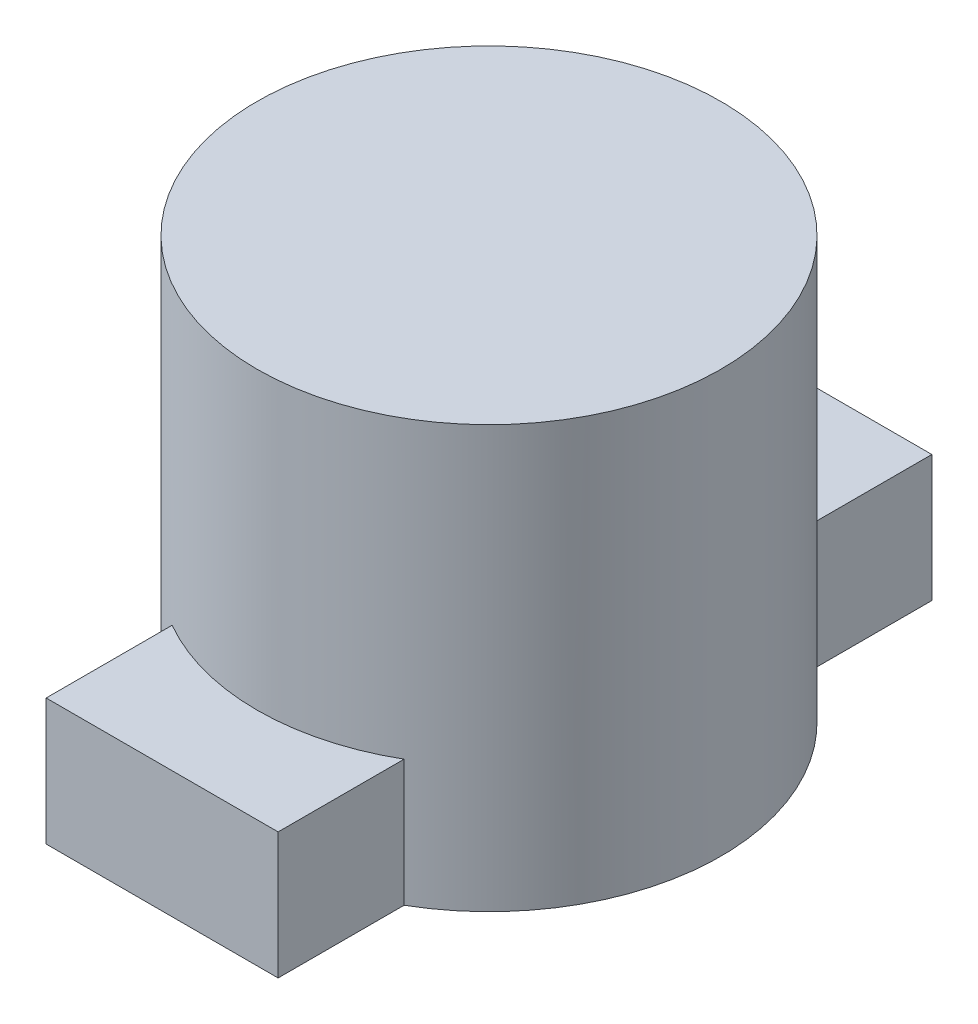
ISO-10303-21;
HEADER;
FILE_DESCRIPTION(('STEP AP214'),'2;1');
FILE_NAME('part.step','',(''),(''),'','','');
FILE_SCHEMA(('AUTOMOTIVE_DESIGN { 1 0 10303 214 1 1 1 1 }'));
ENDSEC;
DATA;
#1=APPLICATION_CONTEXT('core data for automotive mechanical design processes');
#2=APPLICATION_PROTOCOL_DEFINITION('international standard','automotive_design',2000,#1);
#3=PRODUCT_CONTEXT('',#1,'mechanical');
#4=PRODUCT('Part','Part','',(#3));
#5=PRODUCT_RELATED_PRODUCT_CATEGORY('part','',(#4));
#6=PRODUCT_DEFINITION_FORMATION('','',#4);
#7=PRODUCT_DEFINITION_CONTEXT('part definition',#1,'design');
#8=PRODUCT_DEFINITION('design','',#6,#7);
#9=PRODUCT_DEFINITION_SHAPE('','',#8);
#10=(LENGTH_UNIT() NAMED_UNIT(*) SI_UNIT(.MILLI.,.METRE.));
#11=(NAMED_UNIT(*) PLANE_ANGLE_UNIT() SI_UNIT($,.RADIAN.));
#12=(NAMED_UNIT(*) SI_UNIT($,.STERADIAN.) SOLID_ANGLE_UNIT());
#13=UNCERTAINTY_MEASURE_WITH_UNIT(LENGTH_MEASURE(1.E-05),#10,'distance_accuracy_value','');
#14=(GEOMETRIC_REPRESENTATION_CONTEXT(3) GLOBAL_UNCERTAINTY_ASSIGNED_CONTEXT((#13)) GLOBAL_UNIT_ASSIGNED_CONTEXT((#10,
#11,#12)) REPRESENTATION_CONTEXT('',''));
#15=CARTESIAN_POINT('',(0.,0.,0.));
#16=DIRECTION('',(0.,0.,1.));
#17=DIRECTION('',(1.,0.,0.));
#18=AXIS2_PLACEMENT_3D('',#15,#16,#17);
#19=CARTESIAN_POINT('',(-6.88151107729453,10.,6.29378807044685));
#20=DIRECTION('',(0.,-1.,0.));
#21=DIRECTION('',(0.,0.,-1.));
#22=AXIS2_PLACEMENT_3D('',#19,#20,#21);
#23=CYLINDRICAL_SURFACE('',#22,5.5);
#24=CARTESIAN_POINT('',(-6.88151107729453,10.,6.29378807044685));
#25=DIRECTION('',(0.,1.,0.));
#26=DIRECTION('',(0.,0.,1.));
#27=AXIS2_PLACEMENT_3D('',#24,#25,#26);
#28=CIRCLE('',#27,5.5);
#29=CARTESIAN_POINT('',(-6.88151107729453,10.,11.7937880704469));
#30=VERTEX_POINT('',#29);
#31=EDGE_CURVE('E134',#30,#30,#28,.T.);
#32=ORIENTED_EDGE('',*,*,#31,.F.);
#33=EDGE_LOOP('',(#32));
#34=FACE_BOUND('',#33,.T.);
#35=DIRECTION('',(0.,-1.,0.));
#36=VECTOR('',#35,1.);
#37=CARTESIAN_POINT('',(-9.63151107729453,10.,1.53064834963244));
#38=LINE('',#37,#36);
#39=CARTESIAN_POINT('',(-9.63151107729453,0.,1.53064834963244));
#40=VERTEX_POINT('',#39);
#41=CARTESIAN_POINT('',(-9.63151107729453,3.,1.53064834963244));
#42=VERTEX_POINT('',#41);
#43=EDGE_CURVE('E129',#40,#42,#38,.F.);
#44=ORIENTED_EDGE('',*,*,#43,.F.);
#45=CARTESIAN_POINT('',(-6.88151107729453,0.,6.29378807044685));
#46=DIRECTION('',(0.,1.,0.));
#47=DIRECTION('',(0.,0.,1.));
#48=AXIS2_PLACEMENT_3D('',#45,#46,#47);
#49=CIRCLE('',#48,5.5);
#50=CARTESIAN_POINT('',(-9.63151107729453,0.,11.0569277912613));
#51=VERTEX_POINT('',#50);
#52=EDGE_CURVE('E133',#40,#51,#49,.T.);
#53=ORIENTED_EDGE('',*,*,#52,.T.);
#54=DIRECTION('',(0.,-1.,0.));
#55=VECTOR('',#54,1.);
#56=CARTESIAN_POINT('',(-9.63151107729453,10.,11.0569277912613));
#57=LINE('',#56,#55);
#58=CARTESIAN_POINT('',(-9.63151107729453,3.,11.0569277912613));
#59=VERTEX_POINT('',#58);
#60=EDGE_CURVE('E131',#59,#51,#57,.T.);
#61=ORIENTED_EDGE('',*,*,#60,.F.);
#62=CARTESIAN_POINT('',(-6.88151107729453,3.,6.29378807044685));
#63=DIRECTION('',(0.,1.,0.));
#64=DIRECTION('',(0.,0.,1.));
#65=AXIS2_PLACEMENT_3D('',#62,#63,#64);
#66=CIRCLE('',#65,5.5);
#67=CARTESIAN_POINT('',(-4.13151107729453,3.,11.0569277912613));
#68=VERTEX_POINT('',#67);
#69=EDGE_CURVE('E37',#59,#68,#66,.T.);
#70=ORIENTED_EDGE('',*,*,#69,.T.);
#71=DIRECTION('',(0.,-1.,0.));
#72=VECTOR('',#71,1.);
#73=CARTESIAN_POINT('',(-4.13151107729453,10.,11.0569277912613));
#74=LINE('',#73,#72);
#75=CARTESIAN_POINT('',(-4.13151107729453,0.,11.0569277912613));
#76=VERTEX_POINT('',#75);
#77=EDGE_CURVE('E120',#76,#68,#74,.F.);
#78=ORIENTED_EDGE('',*,*,#77,.F.);
#79=CARTESIAN_POINT('',(-4.13151107729453,0.,1.53064834963244));
#80=VERTEX_POINT('',#79);
#81=EDGE_CURVE('E136',#76,#80,#49,.T.);
#82=ORIENTED_EDGE('',*,*,#81,.T.);
#83=DIRECTION('',(0.,-1.,0.));
#84=VECTOR('',#83,1.);
#85=CARTESIAN_POINT('',(-4.13151107729453,10.,1.53064834963244));
#86=LINE('',#85,#84);
#87=CARTESIAN_POINT('',(-4.13151107729453,3.,1.53064834963244));
#88=VERTEX_POINT('',#87);
#89=EDGE_CURVE('E51',#88,#80,#86,.T.);
#90=ORIENTED_EDGE('',*,*,#89,.F.);
#91=EDGE_CURVE('E11',#88,#42,#66,.T.);
#92=ORIENTED_EDGE('',*,*,#91,.T.);
#93=EDGE_LOOP('',(#44,#53,#61,#70,#78,#82,#90,#92));
#94=FACE_BOUND('',#93,.T.);
#95=ADVANCED_FACE('F34',(#34,#94),#23,.T.);
#96=CARTESIAN_POINT('',(-6.88151107729453,10.,6.29378807044685));
#97=DIRECTION('',(0.,1.,0.));
#98=DIRECTION('',(0.,0.,1.));
#99=AXIS2_PLACEMENT_3D('',#96,#97,#98);
#100=PLANE('',#99);
#101=ORIENTED_EDGE('',*,*,#31,.T.);
#102=EDGE_LOOP('',(#101));
#103=FACE_BOUND('',#102,.T.);
#104=ADVANCED_FACE('F189',(#103),#100,.T.);
#105=CARTESIAN_POINT('',(-6.88151107729453,0.,6.29378807044685));
#106=DIRECTION('',(0.,1.,0.));
#107=DIRECTION('',(0.,0.,1.));
#108=AXIS2_PLACEMENT_3D('',#105,#106,#107);
#109=PLANE('',#108);
#110=ORIENTED_EDGE('',*,*,#81,.F.);
#111=DIRECTION('',(0.,0.,-1.));
#112=VECTOR('',#111,1.);
#113=CARTESIAN_POINT('',(-4.13151107729453,0.,-1.45621192955315));
#114=LINE('',#113,#112);
#115=CARTESIAN_POINT('',(-4.13151107729453,0.,14.0437880704469));
#116=VERTEX_POINT('',#115);
#117=EDGE_CURVE('E152',#116,#76,#114,.T.);
#118=ORIENTED_EDGE('',*,*,#117,.F.);
#119=DIRECTION('',(1.,0.,0.));
#120=VECTOR('',#119,1.);
#121=CARTESIAN_POINT('',(-9.63151107729453,0.,14.0437880704469));
#122=LINE('',#121,#120);
#123=CARTESIAN_POINT('',(-9.63151107729453,0.,14.0437880704469));
#124=VERTEX_POINT('',#123);
#125=EDGE_CURVE('E143',#124,#116,#122,.T.);
#126=ORIENTED_EDGE('',*,*,#125,.F.);
#127=DIRECTION('',(0.,0.,1.));
#128=VECTOR('',#127,1.);
#129=CARTESIAN_POINT('',(-9.63151107729453,0.,-1.45621192955315));
#130=LINE('',#129,#128);
#131=EDGE_CURVE('E118',#51,#124,#130,.T.);
#132=ORIENTED_EDGE('',*,*,#131,.F.);
#133=ORIENTED_EDGE('',*,*,#52,.F.);
#134=CARTESIAN_POINT('',(-9.63151107729453,0.,-1.45621192955315));
#135=VERTEX_POINT('',#134);
#136=EDGE_CURVE('E144',#135,#40,#130,.T.);
#137=ORIENTED_EDGE('',*,*,#136,.F.);
#138=DIRECTION('',(-1.,0.,0.));
#139=VECTOR('',#138,1.);
#140=CARTESIAN_POINT('',(-9.63151107729453,0.,-1.45621192955315));
#141=LINE('',#140,#139);
#142=CARTESIAN_POINT('',(-4.13151107729453,0.,-1.45621192955315));
#143=VERTEX_POINT('',#142);
#144=EDGE_CURVE('E105',#143,#135,#141,.T.);
#145=ORIENTED_EDGE('',*,*,#144,.F.);
#146=EDGE_CURVE('E151',#80,#143,#114,.T.);
#147=ORIENTED_EDGE('',*,*,#146,.F.);
#148=EDGE_LOOP('',(#110,#118,#126,#132,#133,#137,#145,#147));
#149=FACE_BOUND('',#148,.T.);
#150=ADVANCED_FACE('F141',(#149),#109,.F.);
#151=CARTESIAN_POINT('',(-9.63151107729453,3.,14.0437880704469));
#152=DIRECTION('',(0.,0.,-1.));
#153=DIRECTION('',(-1.,0.,0.));
#154=AXIS2_PLACEMENT_3D('',#151,#152,#153);
#155=PLANE('',#154);
#156=ORIENTED_EDGE('',*,*,#125,.T.);
#157=DIRECTION('',(0.,-1.,0.));
#158=VECTOR('',#157,1.);
#159=CARTESIAN_POINT('',(-4.13151107729453,3.,14.0437880704469));
#160=LINE('',#159,#158);
#161=CARTESIAN_POINT('',(-4.13151107729453,3.,14.0437880704469));
#162=VERTEX_POINT('',#161);
#163=EDGE_CURVE('E112',#162,#116,#160,.T.);
#164=ORIENTED_EDGE('',*,*,#163,.F.);
#165=DIRECTION('',(1.,0.,0.));
#166=VECTOR('',#165,1.);
#167=CARTESIAN_POINT('',(-9.63151107729453,3.,14.0437880704469));
#168=LINE('',#167,#166);
#169=CARTESIAN_POINT('',(-9.63151107729453,3.,14.0437880704469));
#170=VERTEX_POINT('',#169);
#171=EDGE_CURVE('E99',#170,#162,#168,.T.);
#172=ORIENTED_EDGE('',*,*,#171,.F.);
#173=DIRECTION('',(0.,-1.,0.));
#174=VECTOR('',#173,1.);
#175=CARTESIAN_POINT('',(-9.63151107729453,3.,14.0437880704469));
#176=LINE('',#175,#174);
#177=EDGE_CURVE('E110',#170,#124,#176,.T.);
#178=ORIENTED_EDGE('',*,*,#177,.T.);
#179=EDGE_LOOP('',(#156,#164,#172,#178));
#180=FACE_BOUND('',#179,.T.);
#181=ADVANCED_FACE('F109',(#180),#155,.F.);
#182=CARTESIAN_POINT('',(0.,3.,0.));
#183=DIRECTION('',(0.,1.,0.));
#184=DIRECTION('',(0.,0.,1.));
#185=AXIS2_PLACEMENT_3D('',#182,#183,#184);
#186=PLANE('',#185);
#187=ORIENTED_EDGE('',*,*,#69,.F.);
#188=DIRECTION('',(0.,0.,1.));
#189=VECTOR('',#188,1.);
#190=CARTESIAN_POINT('',(-9.63151107729453,3.,-1.45621192955315));
#191=LINE('',#190,#189);
#192=EDGE_CURVE('E95',#59,#170,#191,.T.);
#193=ORIENTED_EDGE('',*,*,#192,.T.);
#194=ORIENTED_EDGE('',*,*,#171,.T.);
#195=DIRECTION('',(0.,0.,-1.));
#196=VECTOR('',#195,1.);
#197=CARTESIAN_POINT('',(-4.13151107729453,3.,-1.45621192955315));
#198=LINE('',#197,#196);
#199=EDGE_CURVE('E173',#162,#68,#198,.T.);
#200=ORIENTED_EDGE('',*,*,#199,.T.);
#201=EDGE_LOOP('',(#187,#193,#194,#200));
#202=FACE_BOUND('',#201,.T.);
#203=ADVANCED_FACE('F97',(#202),#186,.T.);
#204=CARTESIAN_POINT('',(-4.13151107729453,3.,-1.45621192955315));
#205=DIRECTION('',(-1.,0.,0.));
#206=DIRECTION('',(0.,0.,1.));
#207=AXIS2_PLACEMENT_3D('',#204,#205,#206);
#208=PLANE('',#207);
#209=ORIENTED_EDGE('',*,*,#117,.T.);
#210=ORIENTED_EDGE('',*,*,#77,.T.);
#211=ORIENTED_EDGE('',*,*,#199,.F.);
#212=ORIENTED_EDGE('',*,*,#163,.T.);
#213=EDGE_LOOP('',(#209,#210,#211,#212));
#214=FACE_BOUND('',#213,.T.);
#215=ADVANCED_FACE('F178',(#214),#208,.F.);
#216=CARTESIAN_POINT('',(-9.63151107729453,3.,-1.45621192955315));
#217=DIRECTION('',(1.,0.,0.));
#218=DIRECTION('',(0.,0.,-1.));
#219=AXIS2_PLACEMENT_3D('',#216,#217,#218);
#220=PLANE('',#219);
#221=ORIENTED_EDGE('',*,*,#192,.F.);
#222=ORIENTED_EDGE('',*,*,#60,.T.);
#223=ORIENTED_EDGE('',*,*,#131,.T.);
#224=ORIENTED_EDGE('',*,*,#177,.F.);
#225=EDGE_LOOP('',(#221,#222,#223,#224));
#226=FACE_BOUND('',#225,.T.);
#227=ADVANCED_FACE('F116',(#226),#220,.F.);
#228=ORIENTED_EDGE('',*,*,#91,.F.);
#229=CARTESIAN_POINT('',(-4.13151107729453,3.,-1.45621192955315));
#230=VERTEX_POINT('',#229);
#231=EDGE_CURVE('E114',#88,#230,#198,.T.);
#232=ORIENTED_EDGE('',*,*,#231,.T.);
#233=DIRECTION('',(-1.,0.,0.));
#234=VECTOR('',#233,1.);
#235=CARTESIAN_POINT('',(-9.63151107729453,3.,-1.45621192955315));
#236=LINE('',#235,#234);
#237=CARTESIAN_POINT('',(-9.63151107729453,3.,-1.45621192955315));
#238=VERTEX_POINT('',#237);
#239=EDGE_CURVE('E148',#230,#238,#236,.T.);
#240=ORIENTED_EDGE('',*,*,#239,.T.);
#241=EDGE_CURVE('E104',#238,#42,#191,.T.);
#242=ORIENTED_EDGE('',*,*,#241,.T.);
#243=EDGE_LOOP('',(#228,#232,#240,#242));
#244=FACE_BOUND('',#243,.T.);
#245=ADVANCED_FACE('F174',(#244),#186,.T.);
#246=ORIENTED_EDGE('',*,*,#136,.T.);
#247=ORIENTED_EDGE('',*,*,#43,.T.);
#248=ORIENTED_EDGE('',*,*,#241,.F.);
#249=DIRECTION('',(0.,-1.,0.));
#250=VECTOR('',#249,1.);
#251=CARTESIAN_POINT('',(-9.63151107729453,3.,-1.45621192955315));
#252=LINE('',#251,#250);
#253=EDGE_CURVE('E156',#238,#135,#252,.T.);
#254=ORIENTED_EDGE('',*,*,#253,.T.);
#255=EDGE_LOOP('',(#246,#247,#248,#254));
#256=FACE_BOUND('',#255,.T.);
#257=ADVANCED_FACE('F169',(#256),#220,.F.);
#258=ORIENTED_EDGE('',*,*,#231,.F.);
#259=ORIENTED_EDGE('',*,*,#89,.T.);
#260=ORIENTED_EDGE('',*,*,#146,.T.);
#261=DIRECTION('',(0.,-1.,0.));
#262=VECTOR('',#261,1.);
#263=CARTESIAN_POINT('',(-4.13151107729453,3.,-1.45621192955315));
#264=LINE('',#263,#262);
#265=EDGE_CURVE('E124',#230,#143,#264,.T.);
#266=ORIENTED_EDGE('',*,*,#265,.F.);
#267=EDGE_LOOP('',(#258,#259,#260,#266));
#268=FACE_BOUND('',#267,.T.);
#269=ADVANCED_FACE('F175',(#268),#208,.F.);
#270=CARTESIAN_POINT('',(-9.63151107729453,3.,-1.45621192955315));
#271=DIRECTION('',(0.,0.,1.));
#272=DIRECTION('',(1.,0.,0.));
#273=AXIS2_PLACEMENT_3D('',#270,#271,#272);
#274=PLANE('',#273);
#275=ORIENTED_EDGE('',*,*,#144,.T.);
#276=ORIENTED_EDGE('',*,*,#253,.F.);
#277=ORIENTED_EDGE('',*,*,#239,.F.);
#278=ORIENTED_EDGE('',*,*,#265,.T.);
#279=EDGE_LOOP('',(#275,#276,#277,#278));
#280=FACE_BOUND('',#279,.T.);
#281=ADVANCED_FACE('F163',(#280),#274,.F.);
#282=CLOSED_SHELL('',(#95,#104,#150,#181,#203,#215,#227,#245,#257,#269,#281));
#283=MANIFOLD_SOLID_BREP('B2',#282);
#284=ADVANCED_BREP_SHAPE_REPRESENTATION('',(#18,#283),#14);
#285=SHAPE_DEFINITION_REPRESENTATION(#9,#284);
ENDSEC;
END-ISO-10303-21;
